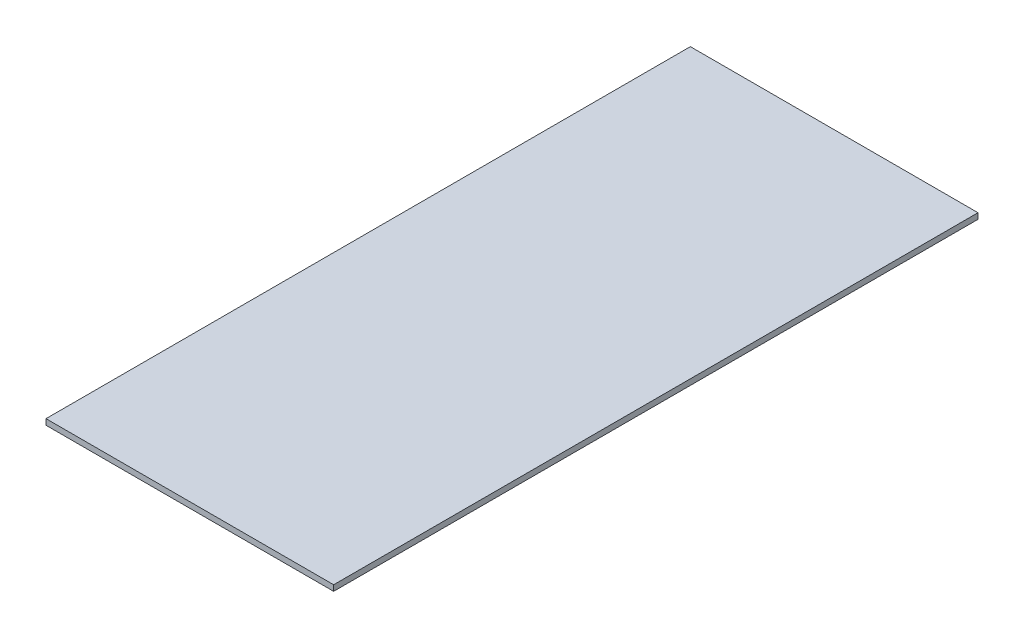
ISO-10303-21;
HEADER;
FILE_DESCRIPTION(('STEP AP214'),'2;1');
FILE_NAME('part.step','',(''),(''),'','','');
FILE_SCHEMA(('AUTOMOTIVE_DESIGN { 1 0 10303 214 1 1 1 1 }'));
ENDSEC;
DATA;
#1=APPLICATION_CONTEXT('core data for automotive mechanical design processes');
#2=APPLICATION_PROTOCOL_DEFINITION('international standard','automotive_design',2000,#1);
#3=PRODUCT_CONTEXT('',#1,'mechanical');
#4=PRODUCT('Part','Part','',(#3));
#5=PRODUCT_RELATED_PRODUCT_CATEGORY('part','',(#4));
#6=PRODUCT_DEFINITION_FORMATION('','',#4);
#7=PRODUCT_DEFINITION_CONTEXT('part definition',#1,'design');
#8=PRODUCT_DEFINITION('design','',#6,#7);
#9=PRODUCT_DEFINITION_SHAPE('','',#8);
#10=(LENGTH_UNIT() NAMED_UNIT(*) SI_UNIT(.MILLI.,.METRE.));
#11=(NAMED_UNIT(*) PLANE_ANGLE_UNIT() SI_UNIT($,.RADIAN.));
#12=(NAMED_UNIT(*) SI_UNIT($,.STERADIAN.) SOLID_ANGLE_UNIT());
#13=UNCERTAINTY_MEASURE_WITH_UNIT(LENGTH_MEASURE(1.E-05),#10,'distance_accuracy_value','');
#14=(GEOMETRIC_REPRESENTATION_CONTEXT(3) GLOBAL_UNCERTAINTY_ASSIGNED_CONTEXT((#13)) GLOBAL_UNIT_ASSIGNED_CONTEXT((#10,
#11,#12)) REPRESENTATION_CONTEXT('',''));
#15=CARTESIAN_POINT('',(0.,0.,0.));
#16=DIRECTION('',(0.,0.,1.));
#17=DIRECTION('',(1.,0.,0.));
#18=AXIS2_PLACEMENT_3D('',#15,#16,#17);
#19=CARTESIAN_POINT('',(0.,3.175,0.));
#20=DIRECTION('',(1.,0.,0.));
#21=DIRECTION('',(0.,0.,-1.));
#22=AXIS2_PLACEMENT_3D('',#19,#20,#21);
#23=PLANE('',#22);
#24=DIRECTION('',(0.,0.,1.));
#25=VECTOR('',#24,1.);
#26=CARTESIAN_POINT('',(0.,0.,0.));
#27=LINE('',#26,#25);
#28=CARTESIAN_POINT('',(0.,0.,-355.6));
#29=VERTEX_POINT('',#28);
#30=CARTESIAN_POINT('',(0.,0.,0.));
#31=VERTEX_POINT('',#30);
#32=EDGE_CURVE('E105',#29,#31,#27,.T.);
#33=ORIENTED_EDGE('',*,*,#32,.T.);
#34=DIRECTION('',(0.,-1.,0.));
#35=VECTOR('',#34,1.);
#36=CARTESIAN_POINT('',(0.,3.175,0.));
#37=LINE('',#36,#35);
#38=CARTESIAN_POINT('',(0.,3.175,0.));
#39=VERTEX_POINT('',#38);
#40=EDGE_CURVE('E11',#39,#31,#37,.T.);
#41=ORIENTED_EDGE('',*,*,#40,.F.);
#42=DIRECTION('',(0.,0.,1.));
#43=VECTOR('',#42,1.);
#44=CARTESIAN_POINT('',(0.,3.175,0.));
#45=LINE('',#44,#43);
#46=CARTESIAN_POINT('',(0.,3.175,-355.6));
#47=VERTEX_POINT('',#46);
#48=EDGE_CURVE('E89',#47,#39,#45,.T.);
#49=ORIENTED_EDGE('',*,*,#48,.F.);
#50=DIRECTION('',(0.,-1.,0.));
#51=VECTOR('',#50,1.);
#52=CARTESIAN_POINT('',(0.,3.175,-355.6));
#53=LINE('',#52,#51);
#54=EDGE_CURVE('E98',#47,#29,#53,.T.);
#55=ORIENTED_EDGE('',*,*,#54,.T.);
#56=EDGE_LOOP('',(#33,#41,#49,#55));
#57=FACE_BOUND('',#56,.T.);
#58=ADVANCED_FACE('F39',(#57),#23,.F.);
#59=CARTESIAN_POINT('',(0.,3.175,0.));
#60=DIRECTION('',(0.,0.,-1.));
#61=DIRECTION('',(-1.,0.,0.));
#62=AXIS2_PLACEMENT_3D('',#59,#60,#61);
#63=PLANE('',#62);
#64=DIRECTION('',(1.,0.,0.));
#65=VECTOR('',#64,1.);
#66=CARTESIAN_POINT('',(0.,0.,0.));
#67=LINE('',#66,#65);
#68=CARTESIAN_POINT('',(158.75,0.,0.));
#69=VERTEX_POINT('',#68);
#70=EDGE_CURVE('E94',#31,#69,#67,.T.);
#71=ORIENTED_EDGE('',*,*,#70,.T.);
#72=DIRECTION('',(0.,-1.,0.));
#73=VECTOR('',#72,1.);
#74=CARTESIAN_POINT('',(158.75,3.175,0.));
#75=LINE('',#74,#73);
#76=CARTESIAN_POINT('',(158.75,3.175,0.));
#77=VERTEX_POINT('',#76);
#78=EDGE_CURVE('E50',#77,#69,#75,.T.);
#79=ORIENTED_EDGE('',*,*,#78,.F.);
#80=DIRECTION('',(1.,0.,0.));
#81=VECTOR('',#80,1.);
#82=CARTESIAN_POINT('',(0.,3.175,0.));
#83=LINE('',#82,#81);
#84=EDGE_CURVE('E84',#39,#77,#83,.T.);
#85=ORIENTED_EDGE('',*,*,#84,.F.);
#86=ORIENTED_EDGE('',*,*,#40,.T.);
#87=EDGE_LOOP('',(#71,#79,#85,#86));
#88=FACE_BOUND('',#87,.T.);
#89=ADVANCED_FACE('F91',(#88),#63,.F.);
#90=CARTESIAN_POINT('',(158.75,3.175,0.));
#91=DIRECTION('',(-1.,0.,0.));
#92=DIRECTION('',(0.,0.,1.));
#93=AXIS2_PLACEMENT_3D('',#90,#91,#92);
#94=PLANE('',#93);
#95=DIRECTION('',(0.,0.,-1.));
#96=VECTOR('',#95,1.);
#97=CARTESIAN_POINT('',(158.75,0.,0.));
#98=LINE('',#97,#96);
#99=CARTESIAN_POINT('',(158.75,0.,-355.6));
#100=VERTEX_POINT('',#99);
#101=EDGE_CURVE('E75',#69,#100,#98,.T.);
#102=ORIENTED_EDGE('',*,*,#101,.T.);
#103=DIRECTION('',(0.,-1.,0.));
#104=VECTOR('',#103,1.);
#105=CARTESIAN_POINT('',(158.75,3.175,-355.6));
#106=LINE('',#105,#104);
#107=CARTESIAN_POINT('',(158.75,3.175,-355.6));
#108=VERTEX_POINT('',#107);
#109=EDGE_CURVE('E92',#108,#100,#106,.T.);
#110=ORIENTED_EDGE('',*,*,#109,.F.);
#111=DIRECTION('',(0.,0.,-1.));
#112=VECTOR('',#111,1.);
#113=CARTESIAN_POINT('',(158.75,3.175,0.));
#114=LINE('',#113,#112);
#115=EDGE_CURVE('E86',#77,#108,#114,.T.);
#116=ORIENTED_EDGE('',*,*,#115,.F.);
#117=ORIENTED_EDGE('',*,*,#78,.T.);
#118=EDGE_LOOP('',(#102,#110,#116,#117));
#119=FACE_BOUND('',#118,.T.);
#120=ADVANCED_FACE('F96',(#119),#94,.F.);
#121=CARTESIAN_POINT('',(0.,3.175,-355.6));
#122=DIRECTION('',(0.,0.,1.));
#123=DIRECTION('',(1.,0.,0.));
#124=AXIS2_PLACEMENT_3D('',#121,#122,#123);
#125=PLANE('',#124);
#126=DIRECTION('',(-1.,0.,0.));
#127=VECTOR('',#126,1.);
#128=CARTESIAN_POINT('',(0.,0.,-355.6));
#129=LINE('',#128,#127);
#130=EDGE_CURVE('E79',#100,#29,#129,.T.);
#131=ORIENTED_EDGE('',*,*,#130,.T.);
#132=ORIENTED_EDGE('',*,*,#54,.F.);
#133=DIRECTION('',(-1.,0.,0.));
#134=VECTOR('',#133,1.);
#135=CARTESIAN_POINT('',(0.,3.175,-355.6));
#136=LINE('',#135,#134);
#137=EDGE_CURVE('E54',#108,#47,#136,.T.);
#138=ORIENTED_EDGE('',*,*,#137,.F.);
#139=ORIENTED_EDGE('',*,*,#109,.T.);
#140=EDGE_LOOP('',(#131,#132,#138,#139));
#141=FACE_BOUND('',#140,.T.);
#142=ADVANCED_FACE('F108',(#141),#125,.F.);
#143=CARTESIAN_POINT('',(0.,3.175,0.));
#144=DIRECTION('',(0.,-1.,0.));
#145=DIRECTION('',(0.,0.,-1.));
#146=AXIS2_PLACEMENT_3D('',#143,#144,#145);
#147=PLANE('',#146);
#148=ORIENTED_EDGE('',*,*,#48,.T.);
#149=ORIENTED_EDGE('',*,*,#84,.T.);
#150=ORIENTED_EDGE('',*,*,#115,.T.);
#151=ORIENTED_EDGE('',*,*,#137,.T.);
#152=EDGE_LOOP('',(#148,#149,#150,#151));
#153=FACE_BOUND('',#152,.T.);
#154=ADVANCED_FACE('F88',(#153),#147,.F.);
#155=CARTESIAN_POINT('',(0.,0.,0.));
#156=DIRECTION('',(0.,-1.,0.));
#157=DIRECTION('',(0.,0.,-1.));
#158=AXIS2_PLACEMENT_3D('',#155,#156,#157);
#159=PLANE('',#158);
#160=ORIENTED_EDGE('',*,*,#32,.F.);
#161=ORIENTED_EDGE('',*,*,#130,.F.);
#162=ORIENTED_EDGE('',*,*,#101,.F.);
#163=ORIENTED_EDGE('',*,*,#70,.F.);
#164=EDGE_LOOP('',(#160,#161,#162,#163));
#165=FACE_BOUND('',#164,.T.);
#166=ADVANCED_FACE('F115',(#165),#159,.T.);
#167=CLOSED_SHELL('',(#58,#89,#120,#142,#154,#166));
#168=MANIFOLD_SOLID_BREP('B2',#167);
#169=ADVANCED_BREP_SHAPE_REPRESENTATION('',(#18,#168),#14);
#170=SHAPE_DEFINITION_REPRESENTATION(#9,#169);
ENDSEC;
END-ISO-10303-21;
